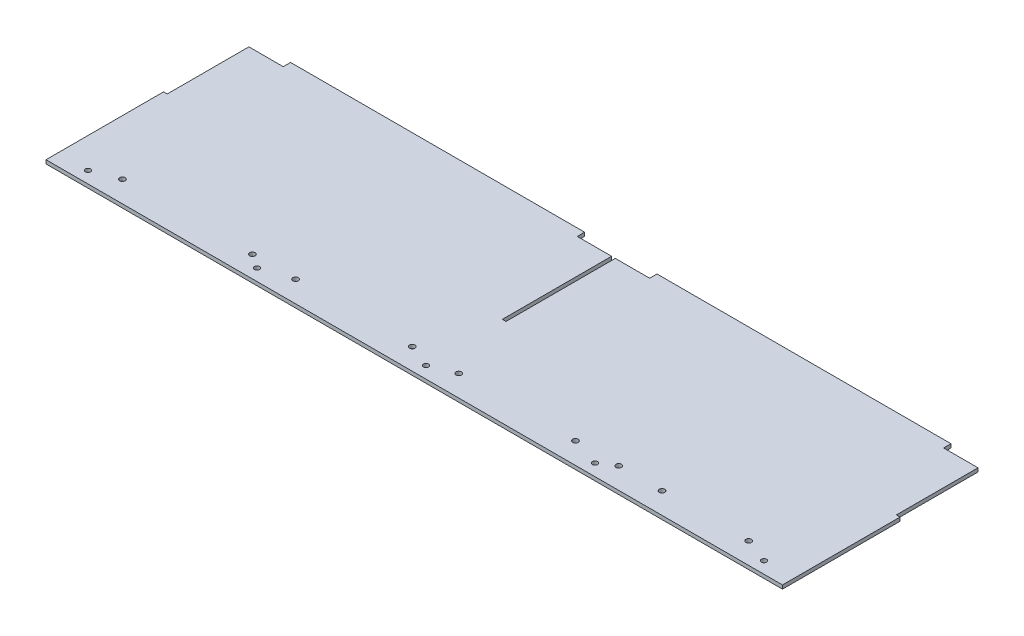
ISO-10303-21;
HEADER;
FILE_DESCRIPTION(('STEP AP214'),'2;1');
FILE_NAME('part.step','',(''),(''),'','','');
FILE_SCHEMA(('AUTOMOTIVE_DESIGN { 1 0 10303 214 1 1 1 1 }'));
ENDSEC;
DATA;
#1=APPLICATION_CONTEXT('core data for automotive mechanical design processes');
#2=APPLICATION_PROTOCOL_DEFINITION('international standard','automotive_design',2000,#1);
#3=PRODUCT_CONTEXT('',#1,'mechanical');
#4=PRODUCT('Part','Part','',(#3));
#5=PRODUCT_RELATED_PRODUCT_CATEGORY('part','',(#4));
#6=PRODUCT_DEFINITION_FORMATION('','',#4);
#7=PRODUCT_DEFINITION_CONTEXT('part definition',#1,'design');
#8=PRODUCT_DEFINITION('design','',#6,#7);
#9=PRODUCT_DEFINITION_SHAPE('','',#8);
#10=(LENGTH_UNIT() NAMED_UNIT(*) SI_UNIT(.MILLI.,.METRE.));
#11=(NAMED_UNIT(*) PLANE_ANGLE_UNIT() SI_UNIT($,.RADIAN.));
#12=(NAMED_UNIT(*) SI_UNIT($,.STERADIAN.) SOLID_ANGLE_UNIT());
#13=UNCERTAINTY_MEASURE_WITH_UNIT(LENGTH_MEASURE(1.E-05),#10,'distance_accuracy_value','');
#14=(GEOMETRIC_REPRESENTATION_CONTEXT(3) GLOBAL_UNCERTAINTY_ASSIGNED_CONTEXT((#13)) GLOBAL_UNIT_ASSIGNED_CONTEXT((#10,
#11,#12)) REPRESENTATION_CONTEXT('',''));
#15=CARTESIAN_POINT('',(0.,0.,0.));
#16=DIRECTION('',(0.,0.,1.));
#17=DIRECTION('',(1.,0.,0.));
#18=AXIS2_PLACEMENT_3D('',#15,#16,#17);
#19=CARTESIAN_POINT('',(629.90984,3.175,0.));
#20=DIRECTION('',(-1.,0.,0.));
#21=DIRECTION('',(0.,0.,-1.));
#22=AXIS2_PLACEMENT_3D('',#19,#20,#21);
#23=PLANE('',#22);
#24=DIRECTION('',(0.,0.,-1.));
#25=VECTOR('',#24,1.);
#26=CARTESIAN_POINT('',(629.90984,3.175,0.));
#27=LINE('',#26,#25);
#28=CARTESIAN_POINT('',(629.90984,3.175,-77.20584));
#29=VERTEX_POINT('',#28);
#30=CARTESIAN_POINT('',(629.90984,3.175,-147.69846));
#31=VERTEX_POINT('',#30);
#32=EDGE_CURVE('E258',#29,#31,#27,.T.);
#33=ORIENTED_EDGE('',*,*,#32,.F.);
#34=DIRECTION('',(0.,-1.,0.));
#35=VECTOR('',#34,1.);
#36=CARTESIAN_POINT('',(629.90984,3.175,-77.20584));
#37=LINE('',#36,#35);
#38=CARTESIAN_POINT('',(629.90984,0.,-77.20584));
#39=VERTEX_POINT('',#38);
#40=EDGE_CURVE('E217',#29,#39,#37,.T.);
#41=ORIENTED_EDGE('',*,*,#40,.T.);
#42=DIRECTION('',(0.,0.,-1.));
#43=VECTOR('',#42,1.);
#44=CARTESIAN_POINT('',(629.90984,0.,0.));
#45=LINE('',#44,#43);
#46=CARTESIAN_POINT('',(629.90984,0.,-147.69846));
#47=VERTEX_POINT('',#46);
#48=EDGE_CURVE('E283',#39,#47,#45,.T.);
#49=ORIENTED_EDGE('',*,*,#48,.T.);
#50=DIRECTION('',(0.,1.,0.));
#51=VECTOR('',#50,1.);
#52=CARTESIAN_POINT('',(629.90984,3.175,-147.69846));
#53=LINE('',#52,#51);
#54=EDGE_CURVE('E318',#47,#31,#53,.T.);
#55=ORIENTED_EDGE('',*,*,#54,.T.);
#56=EDGE_LOOP('',(#33,#41,#49,#55));
#57=FACE_BOUND('',#56,.T.);
#58=ADVANCED_FACE('F38',(#57),#23,.F.);
#59=CARTESIAN_POINT('',(313.36742,3.175,-53.3320399735148));
#60=DIRECTION('',(0.,0.,-1.));
#61=DIRECTION('',(1.,0.,0.));
#62=AXIS2_PLACEMENT_3D('',#59,#60,#61);
#63=PLANE('',#62);
#64=DIRECTION('',(0.,1.,0.));
#65=VECTOR('',#64,1.);
#66=CARTESIAN_POINT('',(316.54242,3.175,-53.3320399735148));
#67=LINE('',#66,#65);
#68=CARTESIAN_POINT('',(316.54242,0.,-53.3320399735148));
#69=VERTEX_POINT('',#68);
#70=CARTESIAN_POINT('',(316.54242,3.175,-53.3320399735148));
#71=VERTEX_POINT('',#70);
#72=EDGE_CURVE('E11',#69,#71,#67,.T.);
#73=ORIENTED_EDGE('',*,*,#72,.F.);
#74=DIRECTION('',(1.,0.,0.));
#75=VECTOR('',#74,1.);
#76=CARTESIAN_POINT('',(0.,0.,-53.3320399735148));
#77=LINE('',#76,#75);
#78=CARTESIAN_POINT('',(313.36742,0.,-53.3320399735148));
#79=VERTEX_POINT('',#78);
#80=EDGE_CURVE('E305',#79,#69,#77,.T.);
#81=ORIENTED_EDGE('',*,*,#80,.F.);
#82=DIRECTION('',(0.,1.,0.));
#83=VECTOR('',#82,1.);
#84=CARTESIAN_POINT('',(313.36742,3.175,-53.3320399735148));
#85=LINE('',#84,#83);
#86=CARTESIAN_POINT('',(313.36742,3.175,-53.3320399735148));
#87=VERTEX_POINT('',#86);
#88=EDGE_CURVE('E47',#79,#87,#85,.T.);
#89=ORIENTED_EDGE('',*,*,#88,.T.);
#90=DIRECTION('',(1.,0.,0.));
#91=VECTOR('',#90,1.);
#92=CARTESIAN_POINT('',(313.36742,3.175,-53.3320399735148));
#93=LINE('',#92,#91);
#94=EDGE_CURVE('E240',#87,#71,#93,.T.);
#95=ORIENTED_EDGE('',*,*,#94,.T.);
#96=EDGE_LOOP('',(#73,#81,#89,#95));
#97=FACE_BOUND('',#96,.T.);
#98=ADVANCED_FACE('F336',(#97),#63,.T.);
#99=CARTESIAN_POINT('',(313.36742,3.175,-53.3320399735148));
#100=DIRECTION('',(1.,0.,0.));
#101=DIRECTION('',(0.,0.,1.));
#102=AXIS2_PLACEMENT_3D('',#99,#100,#101);
#103=PLANE('',#102);
#104=ORIENTED_EDGE('',*,*,#88,.F.);
#105=DIRECTION('',(0.,0.,-1.));
#106=VECTOR('',#105,1.);
#107=CARTESIAN_POINT('',(313.36742,0.,0.));
#108=LINE('',#107,#106);
#109=CARTESIAN_POINT('',(313.36742,0.,-147.69846));
#110=VERTEX_POINT('',#109);
#111=EDGE_CURVE('E302',#110,#79,#108,.F.);
#112=ORIENTED_EDGE('',*,*,#111,.F.);
#113=DIRECTION('',(0.,1.,0.));
#114=VECTOR('',#113,1.);
#115=CARTESIAN_POINT('',(313.36742,3.175,-147.69846));
#116=LINE('',#115,#114);
#117=CARTESIAN_POINT('',(313.36742,3.175,-147.69846));
#118=VERTEX_POINT('',#117);
#119=EDGE_CURVE('E331',#110,#118,#116,.T.);
#120=ORIENTED_EDGE('',*,*,#119,.T.);
#121=DIRECTION('',(0.,0.,1.));
#122=VECTOR('',#121,1.);
#123=CARTESIAN_POINT('',(313.36742,3.175,-53.3320399735148));
#124=LINE('',#123,#122);
#125=EDGE_CURVE('E243',#118,#87,#124,.T.);
#126=ORIENTED_EDGE('',*,*,#125,.T.);
#127=EDGE_LOOP('',(#104,#112,#120,#126));
#128=FACE_BOUND('',#127,.T.);
#129=ADVANCED_FACE('F345',(#128),#103,.T.);
#130=CARTESIAN_POINT('',(0.,3.175,-147.69846));
#131=DIRECTION('',(0.,0.,1.));
#132=DIRECTION('',(-1.,0.,0.));
#133=AXIS2_PLACEMENT_3D('',#130,#131,#132);
#134=PLANE('',#133);
#135=ORIENTED_EDGE('',*,*,#119,.F.);
#136=DIRECTION('',(1.,0.,0.));
#137=VECTOR('',#136,1.);
#138=CARTESIAN_POINT('',(0.,0.,-147.69846));
#139=LINE('',#138,#137);
#140=CARTESIAN_POINT('',(283.68371,0.,-147.69846));
#141=VERTEX_POINT('',#140);
#142=EDGE_CURVE('E299',#110,#141,#139,.F.);
#143=ORIENTED_EDGE('',*,*,#142,.T.);
#144=DIRECTION('',(0.,1.,0.));
#145=VECTOR('',#144,1.);
#146=CARTESIAN_POINT('',(283.68371,3.175,-147.69846));
#147=LINE('',#146,#145);
#148=CARTESIAN_POINT('',(283.68371,3.175,-147.69846));
#149=VERTEX_POINT('',#148);
#150=EDGE_CURVE('E329',#141,#149,#147,.T.);
#151=ORIENTED_EDGE('',*,*,#150,.T.);
#152=DIRECTION('',(-1.,0.,0.));
#153=VECTOR('',#152,1.);
#154=CARTESIAN_POINT('',(0.,3.175,-147.69846));
#155=LINE('',#154,#153);
#156=EDGE_CURVE('E237',#118,#149,#155,.T.);
#157=ORIENTED_EDGE('',*,*,#156,.F.);
#158=EDGE_LOOP('',(#135,#143,#151,#157));
#159=FACE_BOUND('',#158,.T.);
#160=ADVANCED_FACE('F348',(#159),#134,.F.);
#161=CARTESIAN_POINT('',(283.68371,3.17499999999993,-154.04846));
#162=DIRECTION('',(1.,0.,0.));
#163=DIRECTION('',(0.,0.,1.));
#164=AXIS2_PLACEMENT_3D('',#161,#162,#163);
#165=PLANE('',#164);
#166=ORIENTED_EDGE('',*,*,#150,.F.);
#167=DIRECTION('',(0.,0.,-1.));
#168=VECTOR('',#167,1.);
#169=CARTESIAN_POINT('',(283.68371,0.,0.));
#170=LINE('',#169,#168);
#171=CARTESIAN_POINT('',(283.68371,0.,-154.04846));
#172=VERTEX_POINT('',#171);
#173=EDGE_CURVE('E296',#172,#141,#170,.F.);
#174=ORIENTED_EDGE('',*,*,#173,.F.);
#175=DIRECTION('',(0.,1.,0.));
#176=VECTOR('',#175,1.);
#177=CARTESIAN_POINT('',(283.68371,3.17499999999993,-154.04846));
#178=LINE('',#177,#176);
#179=CARTESIAN_POINT('',(283.68371,3.17499999999993,-154.04846));
#180=VERTEX_POINT('',#179);
#181=EDGE_CURVE('E327',#172,#180,#178,.T.);
#182=ORIENTED_EDGE('',*,*,#181,.T.);
#183=DIRECTION('',(0.,0.,1.));
#184=VECTOR('',#183,1.);
#185=CARTESIAN_POINT('',(283.68371,3.17499999999993,-154.04846));
#186=LINE('',#185,#184);
#187=EDGE_CURVE('E246',#180,#149,#186,.T.);
#188=ORIENTED_EDGE('',*,*,#187,.T.);
#189=EDGE_LOOP('',(#166,#174,#182,#188));
#190=FACE_BOUND('',#189,.T.);
#191=ADVANCED_FACE('F353',(#190),#165,.T.);
#192=CARTESIAN_POINT('',(283.68371,3.17499999999993,-154.04846));
#193=DIRECTION('',(0.,0.,-1.));
#194=DIRECTION('',(1.,0.,0.));
#195=AXIS2_PLACEMENT_3D('',#192,#193,#194);
#196=PLANE('',#195);
#197=ORIENTED_EDGE('',*,*,#181,.F.);
#198=DIRECTION('',(1.,0.,0.));
#199=VECTOR('',#198,1.);
#200=CARTESIAN_POINT('',(0.,0.,-154.04846));
#201=LINE('',#200,#199);
#202=CARTESIAN_POINT('',(29.6837100000001,0.,-154.04846));
#203=VERTEX_POINT('',#202);
#204=EDGE_CURVE('E293',#203,#172,#201,.T.);
#205=ORIENTED_EDGE('',*,*,#204,.F.);
#206=DIRECTION('',(0.,1.,0.));
#207=VECTOR('',#206,1.);
#208=CARTESIAN_POINT('',(29.6837100000001,3.17499999999993,-154.04846));
#209=LINE('',#208,#207);
#210=CARTESIAN_POINT('',(29.6837100000001,3.17499999999993,-154.04846));
#211=VERTEX_POINT('',#210);
#212=EDGE_CURVE('E325',#203,#211,#209,.T.);
#213=ORIENTED_EDGE('',*,*,#212,.T.);
#214=DIRECTION('',(1.,0.,0.));
#215=VECTOR('',#214,1.);
#216=CARTESIAN_POINT('',(283.68371,3.17499999999993,-154.04846));
#217=LINE('',#216,#215);
#218=EDGE_CURVE('E249',#211,#180,#217,.T.);
#219=ORIENTED_EDGE('',*,*,#218,.T.);
#220=EDGE_LOOP('',(#197,#205,#213,#219));
#221=FACE_BOUND('',#220,.T.);
#222=ADVANCED_FACE('F409',(#221),#196,.T.);
#223=CARTESIAN_POINT('',(29.6837100000001,3.17499999999993,-154.04846));
#224=DIRECTION('',(1.,0.,0.));
#225=DIRECTION('',(0.,0.,1.));
#226=AXIS2_PLACEMENT_3D('',#223,#224,#225);
#227=PLANE('',#226);
#228=ORIENTED_EDGE('',*,*,#212,.F.);
#229=DIRECTION('',(0.,0.,-1.));
#230=VECTOR('',#229,1.);
#231=CARTESIAN_POINT('',(29.6837100000001,0.,0.));
#232=LINE('',#231,#230);
#233=CARTESIAN_POINT('',(29.6837100000001,0.,-147.69846));
#234=VERTEX_POINT('',#233);
#235=EDGE_CURVE('E290',#203,#234,#232,.F.);
#236=ORIENTED_EDGE('',*,*,#235,.T.);
#237=DIRECTION('',(0.,1.,0.));
#238=VECTOR('',#237,1.);
#239=CARTESIAN_POINT('',(29.6837100000001,3.175,-147.69846));
#240=LINE('',#239,#238);
#241=CARTESIAN_POINT('',(29.6837100000001,3.175,-147.69846));
#242=VERTEX_POINT('',#241);
#243=EDGE_CURVE('E323',#234,#242,#240,.T.);
#244=ORIENTED_EDGE('',*,*,#243,.T.);
#245=DIRECTION('',(0.,0.,1.));
#246=VECTOR('',#245,1.);
#247=CARTESIAN_POINT('',(29.6837100000001,3.17499999999993,-154.04846));
#248=LINE('',#247,#246);
#249=EDGE_CURVE('E252',#211,#242,#248,.T.);
#250=ORIENTED_EDGE('',*,*,#249,.F.);
#251=EDGE_LOOP('',(#228,#236,#244,#250));
#252=FACE_BOUND('',#251,.T.);
#253=ADVANCED_FACE('F406',(#252),#227,.F.);
#254=ORIENTED_EDGE('',*,*,#243,.F.);
#255=DIRECTION('',(1.,0.,0.));
#256=VECTOR('',#255,1.);
#257=CARTESIAN_POINT('',(0.,0.,-147.69846));
#258=LINE('',#257,#256);
#259=CARTESIAN_POINT('',(0.,0.,-147.69846));
#260=VERTEX_POINT('',#259);
#261=EDGE_CURVE('E287',#234,#260,#258,.F.);
#262=ORIENTED_EDGE('',*,*,#261,.T.);
#263=DIRECTION('',(0.,1.,0.));
#264=VECTOR('',#263,1.);
#265=CARTESIAN_POINT('',(0.,3.175,-147.69846));
#266=LINE('',#265,#264);
#267=CARTESIAN_POINT('',(0.,3.175,-147.69846));
#268=VERTEX_POINT('',#267);
#269=EDGE_CURVE('E321',#260,#268,#266,.T.);
#270=ORIENTED_EDGE('',*,*,#269,.T.);
#271=EDGE_CURVE('E255',#242,#268,#155,.T.);
#272=ORIENTED_EDGE('',*,*,#271,.F.);
#273=EDGE_LOOP('',(#254,#262,#270,#272));
#274=FACE_BOUND('',#273,.T.);
#275=ADVANCED_FACE('F392',(#274),#134,.F.);
#276=CARTESIAN_POINT('',(0.,3.175,0.));
#277=DIRECTION('',(1.,0.,0.));
#278=DIRECTION('',(0.,0.,1.));
#279=AXIS2_PLACEMENT_3D('',#276,#277,#278);
#280=PLANE('',#279);
#281=DIRECTION('',(0.,-1.,0.));
#282=VECTOR('',#281,1.);
#283=CARTESIAN_POINT('',(0.,3.175,-77.20584));
#284=LINE('',#283,#282);
#285=CARTESIAN_POINT('',(0.,3.175,-77.20584));
#286=VERTEX_POINT('',#285);
#287=CARTESIAN_POINT('',(0.,0.,-77.20584));
#288=VERTEX_POINT('',#287);
#289=EDGE_CURVE('E62',#286,#288,#284,.T.);
#290=ORIENTED_EDGE('',*,*,#289,.F.);
#291=DIRECTION('',(0.,0.,1.));
#292=VECTOR('',#291,1.);
#293=CARTESIAN_POINT('',(0.,3.175,0.));
#294=LINE('',#293,#292);
#295=EDGE_CURVE('E256',#268,#286,#294,.T.);
#296=ORIENTED_EDGE('',*,*,#295,.F.);
#297=ORIENTED_EDGE('',*,*,#269,.F.);
#298=DIRECTION('',(0.,0.,-1.));
#299=VECTOR('',#298,1.);
#300=CARTESIAN_POINT('',(0.,0.,0.));
#301=LINE('',#300,#299);
#302=EDGE_CURVE('E285',#260,#288,#301,.F.);
#303=ORIENTED_EDGE('',*,*,#302,.T.);
#304=EDGE_LOOP('',(#290,#296,#297,#303));
#305=FACE_BOUND('',#304,.T.);
#306=ADVANCED_FACE('F394',(#305),#280,.F.);
#307=ORIENTED_EDGE('',*,*,#54,.F.);
#308=DIRECTION('',(1.,0.,0.));
#309=VECTOR('',#308,1.);
#310=CARTESIAN_POINT('',(0.,0.,-147.69846));
#311=LINE('',#310,#309);
#312=CARTESIAN_POINT('',(600.22613,0.,-147.69846));
#313=VERTEX_POINT('',#312);
#314=EDGE_CURVE('E280',#47,#313,#311,.F.);
#315=ORIENTED_EDGE('',*,*,#314,.T.);
#316=DIRECTION('',(0.,1.,0.));
#317=VECTOR('',#316,1.);
#318=CARTESIAN_POINT('',(600.22613,3.175,-147.69846));
#319=LINE('',#318,#317);
#320=CARTESIAN_POINT('',(600.22613,3.175,-147.69846));
#321=VERTEX_POINT('',#320);
#322=EDGE_CURVE('E316',#313,#321,#319,.T.);
#323=ORIENTED_EDGE('',*,*,#322,.T.);
#324=EDGE_CURVE('E236',#31,#321,#155,.T.);
#325=ORIENTED_EDGE('',*,*,#324,.F.);
#326=EDGE_LOOP('',(#307,#315,#323,#325));
#327=FACE_BOUND('',#326,.T.);
#328=ADVANCED_FACE('F384',(#327),#134,.F.);
#329=CARTESIAN_POINT('',(600.22613,3.17499999999993,-154.04846));
#330=DIRECTION('',(1.,0.,0.));
#331=DIRECTION('',(0.,0.,1.));
#332=AXIS2_PLACEMENT_3D('',#329,#330,#331);
#333=PLANE('',#332);
#334=ORIENTED_EDGE('',*,*,#322,.F.);
#335=DIRECTION('',(0.,0.,-1.));
#336=VECTOR('',#335,1.);
#337=CARTESIAN_POINT('',(600.22613,0.,0.));
#338=LINE('',#337,#336);
#339=CARTESIAN_POINT('',(600.22613,0.,-154.04846));
#340=VERTEX_POINT('',#339);
#341=EDGE_CURVE('E277',#340,#313,#338,.F.);
#342=ORIENTED_EDGE('',*,*,#341,.F.);
#343=DIRECTION('',(0.,1.,0.));
#344=VECTOR('',#343,1.);
#345=CARTESIAN_POINT('',(600.22613,3.17499999999993,-154.04846));
#346=LINE('',#345,#344);
#347=CARTESIAN_POINT('',(600.22613,3.17499999999993,-154.04846));
#348=VERTEX_POINT('',#347);
#349=EDGE_CURVE('E314',#340,#348,#346,.T.);
#350=ORIENTED_EDGE('',*,*,#349,.T.);
#351=DIRECTION('',(0.,0.,1.));
#352=VECTOR('',#351,1.);
#353=CARTESIAN_POINT('',(600.22613,3.17499999999993,-154.04846));
#354=LINE('',#353,#352);
#355=EDGE_CURVE('E260',#348,#321,#354,.T.);
#356=ORIENTED_EDGE('',*,*,#355,.T.);
#357=EDGE_LOOP('',(#334,#342,#350,#356));
#358=FACE_BOUND('',#357,.T.);
#359=ADVANCED_FACE('F367',(#358),#333,.T.);
#360=CARTESIAN_POINT('',(600.22613,3.17499999999993,-154.04846));
#361=DIRECTION('',(0.,0.,-1.));
#362=DIRECTION('',(1.,0.,0.));
#363=AXIS2_PLACEMENT_3D('',#360,#361,#362);
#364=PLANE('',#363);
#365=ORIENTED_EDGE('',*,*,#349,.F.);
#366=DIRECTION('',(1.,0.,0.));
#367=VECTOR('',#366,1.);
#368=CARTESIAN_POINT('',(0.,0.,-154.04846));
#369=LINE('',#368,#367);
#370=CARTESIAN_POINT('',(346.22613,0.,-154.04846));
#371=VERTEX_POINT('',#370);
#372=EDGE_CURVE('E274',#371,#340,#369,.T.);
#373=ORIENTED_EDGE('',*,*,#372,.F.);
#374=DIRECTION('',(0.,1.,0.));
#375=VECTOR('',#374,1.);
#376=CARTESIAN_POINT('',(346.22613,3.17499999999993,-154.04846));
#377=LINE('',#376,#375);
#378=CARTESIAN_POINT('',(346.22613,3.17499999999993,-154.04846));
#379=VERTEX_POINT('',#378);
#380=EDGE_CURVE('E312',#371,#379,#377,.T.);
#381=ORIENTED_EDGE('',*,*,#380,.T.);
#382=DIRECTION('',(1.,0.,0.));
#383=VECTOR('',#382,1.);
#384=CARTESIAN_POINT('',(600.22613,3.17499999999993,-154.04846));
#385=LINE('',#384,#383);
#386=EDGE_CURVE('E263',#379,#348,#385,.T.);
#387=ORIENTED_EDGE('',*,*,#386,.T.);
#388=EDGE_LOOP('',(#365,#373,#381,#387));
#389=FACE_BOUND('',#388,.T.);
#390=ADVANCED_FACE('F371',(#389),#364,.T.);
#391=CARTESIAN_POINT('',(346.22613,3.17499999999993,-154.04846));
#392=DIRECTION('',(1.,0.,0.));
#393=DIRECTION('',(0.,0.,1.));
#394=AXIS2_PLACEMENT_3D('',#391,#392,#393);
#395=PLANE('',#394);
#396=ORIENTED_EDGE('',*,*,#380,.F.);
#397=DIRECTION('',(0.,0.,-1.));
#398=VECTOR('',#397,1.);
#399=CARTESIAN_POINT('',(346.22613,0.,0.));
#400=LINE('',#399,#398);
#401=CARTESIAN_POINT('',(346.22613,0.,-147.69846));
#402=VERTEX_POINT('',#401);
#403=EDGE_CURVE('E235',#371,#402,#400,.F.);
#404=ORIENTED_EDGE('',*,*,#403,.T.);
#405=DIRECTION('',(0.,1.,0.));
#406=VECTOR('',#405,1.);
#407=CARTESIAN_POINT('',(346.22613,3.17499999999993,-147.69846));
#408=LINE('',#407,#406);
#409=CARTESIAN_POINT('',(346.22613,3.17499999999993,-147.69846));
#410=VERTEX_POINT('',#409);
#411=EDGE_CURVE('E310',#402,#410,#408,.T.);
#412=ORIENTED_EDGE('',*,*,#411,.T.);
#413=DIRECTION('',(0.,0.,1.));
#414=VECTOR('',#413,1.);
#415=CARTESIAN_POINT('',(346.22613,3.17499999999993,-154.04846));
#416=LINE('',#415,#414);
#417=EDGE_CURVE('E266',#379,#410,#416,.T.);
#418=ORIENTED_EDGE('',*,*,#417,.F.);
#419=EDGE_LOOP('',(#396,#404,#412,#418));
#420=FACE_BOUND('',#419,.T.);
#421=ADVANCED_FACE('F375',(#420),#395,.F.);
#422=ORIENTED_EDGE('',*,*,#411,.F.);
#423=DIRECTION('',(1.,0.,0.));
#424=VECTOR('',#423,1.);
#425=CARTESIAN_POINT('',(0.,0.,-147.69846));
#426=LINE('',#425,#424);
#427=CARTESIAN_POINT('',(316.54242,0.,-147.69846));
#428=VERTEX_POINT('',#427);
#429=EDGE_CURVE('E229',#402,#428,#426,.F.);
#430=ORIENTED_EDGE('',*,*,#429,.T.);
#431=DIRECTION('',(0.,1.,0.));
#432=VECTOR('',#431,1.);
#433=CARTESIAN_POINT('',(316.54242,3.175,-147.69846));
#434=LINE('',#433,#432);
#435=CARTESIAN_POINT('',(316.54242,3.175,-147.69846));
#436=VERTEX_POINT('',#435);
#437=EDGE_CURVE('E42',#428,#436,#434,.T.);
#438=ORIENTED_EDGE('',*,*,#437,.T.);
#439=EDGE_CURVE('E231',#410,#436,#155,.T.);
#440=ORIENTED_EDGE('',*,*,#439,.F.);
#441=EDGE_LOOP('',(#422,#430,#438,#440));
#442=FACE_BOUND('',#441,.T.);
#443=ADVANCED_FACE('F381',(#442),#134,.F.);
#444=CARTESIAN_POINT('',(316.54242,3.175,-53.3320399735148));
#445=DIRECTION('',(-1.,0.,0.));
#446=DIRECTION('',(0.,0.,-1.));
#447=AXIS2_PLACEMENT_3D('',#444,#445,#446);
#448=PLANE('',#447);
#449=DIRECTION('',(0.,0.,-1.));
#450=VECTOR('',#449,1.);
#451=CARTESIAN_POINT('',(316.54242,0.,0.));
#452=LINE('',#451,#450);
#453=EDGE_CURVE('E271',#69,#428,#452,.T.);
#454=ORIENTED_EDGE('',*,*,#453,.F.);
#455=ORIENTED_EDGE('',*,*,#72,.T.);
#456=DIRECTION('',(0.,0.,-1.));
#457=VECTOR('',#456,1.);
#458=CARTESIAN_POINT('',(316.54242,3.175,-53.3320399735148));
#459=LINE('',#458,#457);
#460=EDGE_CURVE('E234',#71,#436,#459,.T.);
#461=ORIENTED_EDGE('',*,*,#460,.T.);
#462=ORIENTED_EDGE('',*,*,#437,.F.);
#463=EDGE_LOOP('',(#454,#455,#461,#462));
#464=FACE_BOUND('',#463,.T.);
#465=ADVANCED_FACE('F40',(#464),#448,.T.);
#466=CARTESIAN_POINT('',(0.,3.175,0.));
#467=DIRECTION('',(0.,-1.,0.));
#468=DIRECTION('',(0.,0.,-1.));
#469=AXIS2_PLACEMENT_3D('',#466,#467,#468);
#470=PLANE('',#469);
#471=CARTESIAN_POINT('',(44.4094127433562,3.175,5.9968400509996));
#472=DIRECTION('',(0.,1.,0.));
#473=DIRECTION('',(0.,0.,1.));
#474=AXIS2_PLACEMENT_3D('',#471,#472,#473);
#475=CIRCLE('',#474,2.39999999999999);
#476=CARTESIAN_POINT('',(44.4094127433562,3.175,8.39684005099958));
#477=VERTEX_POINT('',#476);
#478=EDGE_CURVE('E831',#477,#477,#475,.T.);
#479=ORIENTED_EDGE('',*,*,#478,.F.);
#480=EDGE_LOOP('',(#479));
#481=FACE_BOUND('',#480,.T.);
#482=CARTESIAN_POINT('',(156.683710000082,3.175,5.99684005099821));
#483=DIRECTION('',(0.,1.,0.));
#484=DIRECTION('',(0.,0.,1.));
#485=AXIS2_PLACEMENT_3D('',#482,#483,#484);
#486=CIRCLE('',#485,2.39999999999999);
#487=CARTESIAN_POINT('',(156.683710000082,3.175,8.3968400509982));
#488=VERTEX_POINT('',#487);
#489=EDGE_CURVE('E835',#488,#488,#486,.T.);
#490=ORIENTED_EDGE('',*,*,#489,.F.);
#491=EDGE_LOOP('',(#490));
#492=FACE_BOUND('',#491,.T.);
#493=CARTESIAN_POINT('',(194.108475752326,3.175,5.99684005099771));
#494=DIRECTION('',(0.,1.,0.));
#495=DIRECTION('',(0.,0.,1.));
#496=AXIS2_PLACEMENT_3D('',#493,#494,#495);
#497=CIRCLE('',#496,2.39999999999999);
#498=CARTESIAN_POINT('',(194.108475752326,3.175,8.39684005099769));
#499=VERTEX_POINT('',#498);
#500=EDGE_CURVE('E839',#499,#499,#497,.T.);
#501=ORIENTED_EDGE('',*,*,#500,.F.);
#502=EDGE_LOOP('',(#501));
#503=FACE_BOUND('',#502,.T.);
#504=CARTESIAN_POINT('',(294.859886504606,3.175,5.99684005099632));
#505=DIRECTION('',(0.,1.,0.));
#506=DIRECTION('',(0.,0.,1.));
#507=AXIS2_PLACEMENT_3D('',#504,#505,#506);
#508=CIRCLE('',#507,2.40000000000001);
#509=CARTESIAN_POINT('',(294.859886504606,3.175,8.39684005099634));
#510=VERTEX_POINT('',#509);
#511=EDGE_CURVE('E843',#510,#510,#508,.T.);
#512=ORIENTED_EDGE('',*,*,#511,.F.);
#513=EDGE_LOOP('',(#512));
#514=FACE_BOUND('',#513,.T.);
#515=CARTESIAN_POINT('',(335.049953495407,3.175,5.99684005099604));
#516=DIRECTION('',(0.,1.,0.));
#517=DIRECTION('',(0.,0.,1.));
#518=AXIS2_PLACEMENT_3D('',#515,#516,#517);
#519=CIRCLE('',#518,2.40000000000001);
#520=CARTESIAN_POINT('',(335.049953495407,3.175,8.39684005099606));
#521=VERTEX_POINT('',#520);
#522=EDGE_CURVE('E847',#521,#521,#519,.T.);
#523=ORIENTED_EDGE('',*,*,#522,.F.);
#524=EDGE_LOOP('',(#523));
#525=FACE_BOUND('',#524,.T.);
#526=CARTESIAN_POINT('',(435.801364247687,3.175,5.99684005099599));
#527=DIRECTION('',(0.,1.,0.));
#528=DIRECTION('',(0.,0.,1.));
#529=AXIS2_PLACEMENT_3D('',#526,#527,#528);
#530=CIRCLE('',#529,2.40000000000001);
#531=CARTESIAN_POINT('',(435.801364247687,3.175,8.396840050996));
#532=VERTEX_POINT('',#531);
#533=EDGE_CURVE('E851',#532,#532,#530,.T.);
#534=ORIENTED_EDGE('',*,*,#533,.F.);
#535=EDGE_LOOP('',(#534));
#536=FACE_BOUND('',#535,.T.);
#537=CARTESIAN_POINT('',(473.22612999993,3.175,5.99684005099604));
#538=DIRECTION('',(0.,1.,0.));
#539=DIRECTION('',(0.,0.,1.));
#540=AXIS2_PLACEMENT_3D('',#537,#538,#539);
#541=CIRCLE('',#540,2.40000000000001);
#542=CARTESIAN_POINT('',(473.22612999993,3.175,8.39684005099606));
#543=VERTEX_POINT('',#542);
#544=EDGE_CURVE('E855',#543,#543,#541,.T.);
#545=ORIENTED_EDGE('',*,*,#544,.F.);
#546=EDGE_LOOP('',(#545));
#547=FACE_BOUND('',#546,.T.);
#548=CARTESIAN_POINT('',(510.650895752173,3.175,5.99684005099627));
#549=DIRECTION('',(0.,1.,0.));
#550=DIRECTION('',(0.,0.,1.));
#551=AXIS2_PLACEMENT_3D('',#548,#549,#550);
#552=CIRCLE('',#551,2.39999999999996);
#553=CARTESIAN_POINT('',(510.650895752173,3.175,8.39684005099622));
#554=VERTEX_POINT('',#553);
#555=EDGE_CURVE('E859',#554,#554,#552,.T.);
#556=ORIENTED_EDGE('',*,*,#555,.F.);
#557=EDGE_LOOP('',(#556));
#558=FACE_BOUND('',#557,.T.);
#559=CARTESIAN_POINT('',(585.500427256573,3.175,5.99684005099743));
#560=DIRECTION('',(0.,1.,0.));
#561=DIRECTION('',(0.,0.,1.));
#562=AXIS2_PLACEMENT_3D('',#559,#560,#561);
#563=CIRCLE('',#562,2.39999999999996);
#564=CARTESIAN_POINT('',(585.500427256573,3.175,8.39684005099739));
#565=VERTEX_POINT('',#564);
#566=EDGE_CURVE('E863',#565,#565,#563,.T.);
#567=ORIENTED_EDGE('',*,*,#566,.F.);
#568=EDGE_LOOP('',(#567));
#569=FACE_BOUND('',#568,.T.);
#570=CARTESIAN_POINT('',(606.977733218917,3.175,14.2341599999992));
#571=DIRECTION('',(0.,1.,0.));
#572=DIRECTION('',(0.,0.,1.));
#573=AXIS2_PLACEMENT_3D('',#570,#571,#572);
#574=CIRCLE('',#573,2.25000000000001);
#575=CARTESIAN_POINT('',(606.977733218917,3.175,16.4841599999992));
#576=VERTEX_POINT('',#575);
#577=EDGE_CURVE('E867',#576,#576,#574,.T.);
#578=ORIENTED_EDGE('',*,*,#577,.F.);
#579=EDGE_LOOP('',(#578));
#580=FACE_BOUND('',#579,.T.);
#581=CARTESIAN_POINT('',(460.966326609485,3.175,14.2341600000001));
#582=DIRECTION('',(0.,1.,0.));
#583=DIRECTION('',(0.,0.,1.));
#584=AXIS2_PLACEMENT_3D('',#581,#582,#583);
#585=CIRCLE('',#584,2.24999999999995);
#586=CARTESIAN_POINT('',(460.966326609485,3.175,16.48416));
#587=VERTEX_POINT('',#586);
#588=EDGE_CURVE('E871',#587,#587,#585,.T.);
#589=ORIENTED_EDGE('',*,*,#588,.F.);
#590=EDGE_LOOP('',(#589));
#591=FACE_BOUND('',#590,.T.);
#592=CARTESIAN_POINT('',(314.95492,3.175,14.2341600000001));
#593=DIRECTION('',(0.,1.,0.));
#594=DIRECTION('',(0.,0.,1.));
#595=AXIS2_PLACEMENT_3D('',#592,#593,#594);
#596=CIRCLE('',#595,2.24999999999995);
#597=CARTESIAN_POINT('',(314.95492,3.175,16.48416));
#598=VERTEX_POINT('',#597);
#599=EDGE_CURVE('E875',#598,#598,#596,.T.);
#600=ORIENTED_EDGE('',*,*,#599,.F.);
#601=EDGE_LOOP('',(#600));
#602=FACE_BOUND('',#601,.T.);
#603=CARTESIAN_POINT('',(168.943513390621,3.175,14.2341600000021));
#604=DIRECTION('',(0.,1.,0.));
#605=DIRECTION('',(0.,0.,1.));
#606=AXIS2_PLACEMENT_3D('',#603,#604,#605);
#607=CIRCLE('',#606,2.25000000000001);
#608=CARTESIAN_POINT('',(168.943513390621,3.175,16.4841600000021));
#609=VERTEX_POINT('',#608);
#610=EDGE_CURVE('E879',#609,#609,#607,.T.);
#611=ORIENTED_EDGE('',*,*,#610,.F.);
#612=EDGE_LOOP('',(#611));
#613=FACE_BOUND('',#612,.T.);
#614=CARTESIAN_POINT('',(22.9321067811893,3.175,14.2341600000031));
#615=DIRECTION('',(0.,1.,0.));
#616=DIRECTION('',(0.,0.,1.));
#617=AXIS2_PLACEMENT_3D('',#614,#615,#616);
#618=CIRCLE('',#617,2.25);
#619=CARTESIAN_POINT('',(22.9321067811893,3.175,16.4841600000031));
#620=VERTEX_POINT('',#619);
#621=EDGE_CURVE('E208',#620,#620,#618,.T.);
#622=ORIENTED_EDGE('',*,*,#621,.F.);
#623=EDGE_LOOP('',(#622));
#624=FACE_BOUND('',#623,.T.);
#625=ORIENTED_EDGE('',*,*,#439,.T.);
#626=ORIENTED_EDGE('',*,*,#460,.F.);
#627=ORIENTED_EDGE('',*,*,#94,.F.);
#628=ORIENTED_EDGE('',*,*,#125,.F.);
#629=ORIENTED_EDGE('',*,*,#156,.T.);
#630=ORIENTED_EDGE('',*,*,#187,.F.);
#631=ORIENTED_EDGE('',*,*,#218,.F.);
#632=ORIENTED_EDGE('',*,*,#249,.T.);
#633=ORIENTED_EDGE('',*,*,#271,.T.);
#634=ORIENTED_EDGE('',*,*,#295,.T.);
#635=DIRECTION('',(1.,0.,0.));
#636=VECTOR('',#635,1.);
#637=CARTESIAN_POINT('',(0.,3.175,-77.20584));
#638=LINE('',#637,#636);
#639=CARTESIAN_POINT('',(-3.175,3.175,-77.20584));
#640=VERTEX_POINT('',#639);
#641=EDGE_CURVE('E224',#640,#286,#638,.T.);
#642=ORIENTED_EDGE('',*,*,#641,.F.);
#643=DIRECTION('',(0.,0.,-1.));
#644=VECTOR('',#643,1.);
#645=CARTESIAN_POINT('',(-3.175,3.175,-77.20584));
#646=LINE('',#645,#644);
#647=CARTESIAN_POINT('',(-3.175,3.175,24.39416));
#648=VERTEX_POINT('',#647);
#649=EDGE_CURVE('E222',#648,#640,#646,.T.);
#650=ORIENTED_EDGE('',*,*,#649,.F.);
#651=DIRECTION('',(1.,0.,0.));
#652=VECTOR('',#651,1.);
#653=CARTESIAN_POINT('',(-3.175,3.175,24.39416));
#654=LINE('',#653,#652);
#655=CARTESIAN_POINT('',(633.08484,3.175,24.39416));
#656=VERTEX_POINT('',#655);
#657=EDGE_CURVE('E196',#648,#656,#654,.T.);
#658=ORIENTED_EDGE('',*,*,#657,.T.);
#659=DIRECTION('',(0.,0.,1.));
#660=VECTOR('',#659,1.);
#661=CARTESIAN_POINT('',(633.08484,3.175,0.));
#662=LINE('',#661,#660);
#663=CARTESIAN_POINT('',(633.08484,3.175,-77.20584));
#664=VERTEX_POINT('',#663);
#665=EDGE_CURVE('E215',#664,#656,#662,.T.);
#666=ORIENTED_EDGE('',*,*,#665,.F.);
#667=DIRECTION('',(1.,0.,0.));
#668=VECTOR('',#667,1.);
#669=CARTESIAN_POINT('',(629.90984,3.175,-77.20584));
#670=LINE('',#669,#668);
#671=EDGE_CURVE('E212',#29,#664,#670,.T.);
#672=ORIENTED_EDGE('',*,*,#671,.F.);
#673=ORIENTED_EDGE('',*,*,#32,.T.);
#674=ORIENTED_EDGE('',*,*,#324,.T.);
#675=ORIENTED_EDGE('',*,*,#355,.F.);
#676=ORIENTED_EDGE('',*,*,#386,.F.);
#677=ORIENTED_EDGE('',*,*,#417,.T.);
#678=EDGE_LOOP('',(#625,#626,#627,#628,#629,#630,#631,#632,#633,#634,#642,#650,#658,#666,#672,
#673,#674,#675,#676,#677));
#679=FACE_BOUND('',#678,.T.);
#680=ADVANCED_FACE('F342',(#481,#492,#503,#514,#525,#536,#547,#558,#569,#580,#591,#602,#613,
#624,#679),#470,.F.);
#681=CARTESIAN_POINT('',(0.,0.,0.));
#682=DIRECTION('',(0.,-1.,0.));
#683=DIRECTION('',(0.,0.,-1.));
#684=AXIS2_PLACEMENT_3D('',#681,#682,#683);
#685=PLANE('',#684);
#686=CARTESIAN_POINT('',(44.4094127433562,0.,5.9968400509996));
#687=DIRECTION('',(0.,1.,0.));
#688=DIRECTION('',(0.,0.,1.));
#689=AXIS2_PLACEMENT_3D('',#686,#687,#688);
#690=CIRCLE('',#689,2.4);
#691=CARTESIAN_POINT('',(44.4094127433562,0.,8.3968400509996));
#692=VERTEX_POINT('',#691);
#693=EDGE_CURVE('E949',#692,#692,#690,.T.);
#694=ORIENTED_EDGE('',*,*,#693,.T.);
#695=EDGE_LOOP('',(#694));
#696=FACE_BOUND('',#695,.T.);
#697=CARTESIAN_POINT('',(156.683710000082,0.,5.99684005099821));
#698=DIRECTION('',(0.,1.,0.));
#699=DIRECTION('',(0.,0.,1.));
#700=AXIS2_PLACEMENT_3D('',#697,#698,#699);
#701=CIRCLE('',#700,2.39999999999999);
#702=CARTESIAN_POINT('',(156.683710000082,0.,8.3968400509982));
#703=VERTEX_POINT('',#702);
#704=EDGE_CURVE('E945',#703,#703,#701,.T.);
#705=ORIENTED_EDGE('',*,*,#704,.T.);
#706=EDGE_LOOP('',(#705));
#707=FACE_BOUND('',#706,.T.);
#708=CARTESIAN_POINT('',(194.108475752326,0.,5.99684005099771));
#709=DIRECTION('',(0.,1.,0.));
#710=DIRECTION('',(0.,0.,1.));
#711=AXIS2_PLACEMENT_3D('',#708,#709,#710);
#712=CIRCLE('',#711,2.39999999999999);
#713=CARTESIAN_POINT('',(194.108475752326,0.,8.39684005099769));
#714=VERTEX_POINT('',#713);
#715=EDGE_CURVE('E941',#714,#714,#712,.T.);
#716=ORIENTED_EDGE('',*,*,#715,.T.);
#717=EDGE_LOOP('',(#716));
#718=FACE_BOUND('',#717,.T.);
#719=CARTESIAN_POINT('',(294.859886504606,0.,5.99684005099632));
#720=DIRECTION('',(0.,1.,0.));
#721=DIRECTION('',(0.,0.,1.));
#722=AXIS2_PLACEMENT_3D('',#719,#720,#721);
#723=CIRCLE('',#722,2.40000000000001);
#724=CARTESIAN_POINT('',(294.859886504606,0.,8.39684005099634));
#725=VERTEX_POINT('',#724);
#726=EDGE_CURVE('E937',#725,#725,#723,.T.);
#727=ORIENTED_EDGE('',*,*,#726,.T.);
#728=EDGE_LOOP('',(#727));
#729=FACE_BOUND('',#728,.T.);
#730=CARTESIAN_POINT('',(335.049953495407,0.,5.99684005099604));
#731=DIRECTION('',(0.,1.,0.));
#732=DIRECTION('',(0.,0.,1.));
#733=AXIS2_PLACEMENT_3D('',#730,#731,#732);
#734=CIRCLE('',#733,2.40000000000001);
#735=CARTESIAN_POINT('',(335.049953495407,0.,8.39684005099606));
#736=VERTEX_POINT('',#735);
#737=EDGE_CURVE('E933',#736,#736,#734,.T.);
#738=ORIENTED_EDGE('',*,*,#737,.T.);
#739=EDGE_LOOP('',(#738));
#740=FACE_BOUND('',#739,.T.);
#741=CARTESIAN_POINT('',(435.801364247687,0.,5.99684005099599));
#742=DIRECTION('',(0.,1.,0.));
#743=DIRECTION('',(0.,0.,1.));
#744=AXIS2_PLACEMENT_3D('',#741,#742,#743);
#745=CIRCLE('',#744,2.40000000000001);
#746=CARTESIAN_POINT('',(435.801364247687,0.,8.396840050996));
#747=VERTEX_POINT('',#746);
#748=EDGE_CURVE('E929',#747,#747,#745,.T.);
#749=ORIENTED_EDGE('',*,*,#748,.T.);
#750=EDGE_LOOP('',(#749));
#751=FACE_BOUND('',#750,.T.);
#752=CARTESIAN_POINT('',(473.22612999993,0.,5.99684005099604));
#753=DIRECTION('',(0.,1.,0.));
#754=DIRECTION('',(0.,0.,1.));
#755=AXIS2_PLACEMENT_3D('',#752,#753,#754);
#756=CIRCLE('',#755,2.40000000000001);
#757=CARTESIAN_POINT('',(473.22612999993,0.,8.39684005099606));
#758=VERTEX_POINT('',#757);
#759=EDGE_CURVE('E925',#758,#758,#756,.T.);
#760=ORIENTED_EDGE('',*,*,#759,.T.);
#761=EDGE_LOOP('',(#760));
#762=FACE_BOUND('',#761,.T.);
#763=CARTESIAN_POINT('',(510.650895752173,0.,5.99684005099627));
#764=DIRECTION('',(0.,1.,0.));
#765=DIRECTION('',(0.,0.,1.));
#766=AXIS2_PLACEMENT_3D('',#763,#764,#765);
#767=CIRCLE('',#766,2.39999999999996);
#768=CARTESIAN_POINT('',(510.650895752173,0.,8.39684005099622));
#769=VERTEX_POINT('',#768);
#770=EDGE_CURVE('E890',#769,#769,#767,.T.);
#771=ORIENTED_EDGE('',*,*,#770,.T.);
#772=EDGE_LOOP('',(#771));
#773=FACE_BOUND('',#772,.T.);
#774=CARTESIAN_POINT('',(585.500427256573,0.,5.99684005099743));
#775=DIRECTION('',(0.,1.,0.));
#776=DIRECTION('',(0.,0.,1.));
#777=AXIS2_PLACEMENT_3D('',#774,#775,#776);
#778=CIRCLE('',#777,2.39999999999996);
#779=CARTESIAN_POINT('',(585.500427256573,0.,8.39684005099739));
#780=VERTEX_POINT('',#779);
#781=EDGE_CURVE('E884',#780,#780,#778,.T.);
#782=ORIENTED_EDGE('',*,*,#781,.T.);
#783=EDGE_LOOP('',(#782));
#784=FACE_BOUND('',#783,.T.);
#785=CARTESIAN_POINT('',(606.977733218917,0.,14.2341599999992));
#786=DIRECTION('',(0.,1.,0.));
#787=DIRECTION('',(0.,0.,1.));
#788=AXIS2_PLACEMENT_3D('',#785,#786,#787);
#789=CIRCLE('',#788,2.25000000000001);
#790=CARTESIAN_POINT('',(606.977733218917,0.,16.4841599999992));
#791=VERTEX_POINT('',#790);
#792=EDGE_CURVE('E205',#791,#791,#789,.T.);
#793=ORIENTED_EDGE('',*,*,#792,.T.);
#794=EDGE_LOOP('',(#793));
#795=FACE_BOUND('',#794,.T.);
#796=CARTESIAN_POINT('',(460.966326609485,0.,14.2341600000001));
#797=DIRECTION('',(0.,1.,0.));
#798=DIRECTION('',(0.,0.,1.));
#799=AXIS2_PLACEMENT_3D('',#796,#797,#798);
#800=CIRCLE('',#799,2.24999999999995);
#801=CARTESIAN_POINT('',(460.966326609485,0.,16.48416));
#802=VERTEX_POINT('',#801);
#803=EDGE_CURVE('E897',#802,#802,#800,.T.);
#804=ORIENTED_EDGE('',*,*,#803,.T.);
#805=EDGE_LOOP('',(#804));
#806=FACE_BOUND('',#805,.T.);
#807=CARTESIAN_POINT('',(314.95492,0.,14.2341600000001));
#808=DIRECTION('',(0.,1.,0.));
#809=DIRECTION('',(0.,0.,1.));
#810=AXIS2_PLACEMENT_3D('',#807,#808,#809);
#811=CIRCLE('',#810,2.24999999999995);
#812=CARTESIAN_POINT('',(314.95492,0.,16.48416));
#813=VERTEX_POINT('',#812);
#814=EDGE_CURVE('E901',#813,#813,#811,.T.);
#815=ORIENTED_EDGE('',*,*,#814,.T.);
#816=EDGE_LOOP('',(#815));
#817=FACE_BOUND('',#816,.T.);
#818=CARTESIAN_POINT('',(168.943513390621,0.,14.2341600000021));
#819=DIRECTION('',(0.,1.,0.));
#820=DIRECTION('',(0.,0.,1.));
#821=AXIS2_PLACEMENT_3D('',#818,#819,#820);
#822=CIRCLE('',#821,2.25000000000001);
#823=CARTESIAN_POINT('',(168.943513390621,0.,16.4841600000021));
#824=VERTEX_POINT('',#823);
#825=EDGE_CURVE('E905',#824,#824,#822,.T.);
#826=ORIENTED_EDGE('',*,*,#825,.T.);
#827=EDGE_LOOP('',(#826));
#828=FACE_BOUND('',#827,.T.);
#829=CARTESIAN_POINT('',(22.9321067811893,0.,14.2341600000031));
#830=DIRECTION('',(0.,1.,0.));
#831=DIRECTION('',(0.,0.,1.));
#832=AXIS2_PLACEMENT_3D('',#829,#830,#831);
#833=CIRCLE('',#832,2.25);
#834=CARTESIAN_POINT('',(22.9321067811893,0.,16.4841600000031));
#835=VERTEX_POINT('',#834);
#836=EDGE_CURVE('E883',#835,#835,#833,.T.);
#837=ORIENTED_EDGE('',*,*,#836,.T.);
#838=EDGE_LOOP('',(#837));
#839=FACE_BOUND('',#838,.T.);
#840=ORIENTED_EDGE('',*,*,#429,.F.);
#841=ORIENTED_EDGE('',*,*,#403,.F.);
#842=ORIENTED_EDGE('',*,*,#372,.T.);
#843=ORIENTED_EDGE('',*,*,#341,.T.);
#844=ORIENTED_EDGE('',*,*,#314,.F.);
#845=ORIENTED_EDGE('',*,*,#48,.F.);
#846=DIRECTION('',(1.,0.,0.));
#847=VECTOR('',#846,1.);
#848=CARTESIAN_POINT('',(629.90984,0.,-77.20584));
#849=LINE('',#848,#847);
#850=CARTESIAN_POINT('',(633.08484,0.,-77.20584));
#851=VERTEX_POINT('',#850);
#852=EDGE_CURVE('E54',#39,#851,#849,.T.);
#853=ORIENTED_EDGE('',*,*,#852,.T.);
#854=DIRECTION('',(0.,0.,1.));
#855=VECTOR('',#854,1.);
#856=CARTESIAN_POINT('',(633.08484,0.,0.));
#857=LINE('',#856,#855);
#858=CARTESIAN_POINT('',(633.08484,0.,24.39416));
#859=VERTEX_POINT('',#858);
#860=EDGE_CURVE('E202',#851,#859,#857,.T.);
#861=ORIENTED_EDGE('',*,*,#860,.T.);
#862=DIRECTION('',(1.,0.,0.));
#863=VECTOR('',#862,1.);
#864=CARTESIAN_POINT('',(-3.175,0.,24.39416));
#865=LINE('',#864,#863);
#866=CARTESIAN_POINT('',(-3.175,0.,24.39416));
#867=VERTEX_POINT('',#866);
#868=EDGE_CURVE('E194',#867,#859,#865,.T.);
#869=ORIENTED_EDGE('',*,*,#868,.F.);
#870=DIRECTION('',(0.,0.,-1.));
#871=VECTOR('',#870,1.);
#872=CARTESIAN_POINT('',(-3.175,0.,-77.20584));
#873=LINE('',#872,#871);
#874=CARTESIAN_POINT('',(-3.175,0.,-77.20584));
#875=VERTEX_POINT('',#874);
#876=EDGE_CURVE('E176',#867,#875,#873,.T.);
#877=ORIENTED_EDGE('',*,*,#876,.T.);
#878=DIRECTION('',(1.,0.,0.));
#879=VECTOR('',#878,1.);
#880=CARTESIAN_POINT('',(0.,0.,-77.20584));
#881=LINE('',#880,#879);
#882=EDGE_CURVE('E187',#875,#288,#881,.T.);
#883=ORIENTED_EDGE('',*,*,#882,.T.);
#884=ORIENTED_EDGE('',*,*,#302,.F.);
#885=ORIENTED_EDGE('',*,*,#261,.F.);
#886=ORIENTED_EDGE('',*,*,#235,.F.);
#887=ORIENTED_EDGE('',*,*,#204,.T.);
#888=ORIENTED_EDGE('',*,*,#173,.T.);
#889=ORIENTED_EDGE('',*,*,#142,.F.);
#890=ORIENTED_EDGE('',*,*,#111,.T.);
#891=ORIENTED_EDGE('',*,*,#80,.T.);
#892=ORIENTED_EDGE('',*,*,#453,.T.);
#893=EDGE_LOOP('',(#840,#841,#842,#843,#844,#845,#853,#861,#869,#877,#883,#884,#885,#886,#887,
#888,#889,#890,#891,#892));
#894=FACE_BOUND('',#893,.T.);
#895=ADVANCED_FACE('F200',(#696,#707,#718,#729,#740,#751,#762,#773,#784,#795,#806,#817,#828,
#839,#894),#685,.T.);
#896=CARTESIAN_POINT('',(0.,3.175,-77.20584));
#897=DIRECTION('',(0.,0.,-1.));
#898=DIRECTION('',(-1.,0.,0.));
#899=AXIS2_PLACEMENT_3D('',#896,#897,#898);
#900=PLANE('',#899);
#901=ORIENTED_EDGE('',*,*,#882,.F.);
#902=DIRECTION('',(0.,-1.,0.));
#903=VECTOR('',#902,1.);
#904=CARTESIAN_POINT('',(-3.175,3.175,-77.20584));
#905=LINE('',#904,#903);
#906=EDGE_CURVE('E182',#640,#875,#905,.T.);
#907=ORIENTED_EDGE('',*,*,#906,.F.);
#908=ORIENTED_EDGE('',*,*,#641,.T.);
#909=ORIENTED_EDGE('',*,*,#289,.T.);
#910=EDGE_LOOP('',(#901,#907,#908,#909));
#911=FACE_BOUND('',#910,.T.);
#912=ADVANCED_FACE('F667',(#911),#900,.T.);
#913=CARTESIAN_POINT('',(-3.175,3.175,-77.20584));
#914=DIRECTION('',(-1.,0.,0.));
#915=DIRECTION('',(0.,0.,1.));
#916=AXIS2_PLACEMENT_3D('',#913,#914,#915);
#917=PLANE('',#916);
#918=ORIENTED_EDGE('',*,*,#876,.F.);
#919=DIRECTION('',(0.,1.,0.));
#920=VECTOR('',#919,1.);
#921=CARTESIAN_POINT('',(-3.175,0.,24.39416));
#922=LINE('',#921,#920);
#923=EDGE_CURVE('E180',#867,#648,#922,.T.);
#924=ORIENTED_EDGE('',*,*,#923,.T.);
#925=ORIENTED_EDGE('',*,*,#649,.T.);
#926=ORIENTED_EDGE('',*,*,#906,.T.);
#927=EDGE_LOOP('',(#918,#924,#925,#926));
#928=FACE_BOUND('',#927,.T.);
#929=ADVANCED_FACE('F178',(#928),#917,.T.);
#930=CARTESIAN_POINT('',(633.08484,3.175,0.));
#931=DIRECTION('',(1.,0.,0.));
#932=DIRECTION('',(0.,0.,-1.));
#933=AXIS2_PLACEMENT_3D('',#930,#931,#932);
#934=PLANE('',#933);
#935=ORIENTED_EDGE('',*,*,#860,.F.);
#936=DIRECTION('',(0.,-1.,0.));
#937=VECTOR('',#936,1.);
#938=CARTESIAN_POINT('',(633.08484,3.175,-77.20584));
#939=LINE('',#938,#937);
#940=EDGE_CURVE('E188',#664,#851,#939,.T.);
#941=ORIENTED_EDGE('',*,*,#940,.F.);
#942=ORIENTED_EDGE('',*,*,#665,.T.);
#943=DIRECTION('',(0.,1.,0.));
#944=VECTOR('',#943,1.);
#945=CARTESIAN_POINT('',(633.08484,0.,24.39416));
#946=LINE('',#945,#944);
#947=EDGE_CURVE('E197',#859,#656,#946,.T.);
#948=ORIENTED_EDGE('',*,*,#947,.F.);
#949=EDGE_LOOP('',(#935,#941,#942,#948));
#950=FACE_BOUND('',#949,.T.);
#951=ADVANCED_FACE('F657',(#950),#934,.T.);
#952=CARTESIAN_POINT('',(629.90984,3.175,-77.20584));
#953=DIRECTION('',(0.,0.,-1.));
#954=DIRECTION('',(-1.,0.,0.));
#955=AXIS2_PLACEMENT_3D('',#952,#953,#954);
#956=PLANE('',#955);
#957=ORIENTED_EDGE('',*,*,#852,.F.);
#958=ORIENTED_EDGE('',*,*,#40,.F.);
#959=ORIENTED_EDGE('',*,*,#671,.T.);
#960=ORIENTED_EDGE('',*,*,#940,.T.);
#961=EDGE_LOOP('',(#957,#958,#959,#960));
#962=FACE_BOUND('',#961,.T.);
#963=ADVANCED_FACE('F653',(#962),#956,.T.);
#964=CARTESIAN_POINT('',(-3.175,0.,24.39416));
#965=DIRECTION('',(0.,0.,1.));
#966=DIRECTION('',(1.,0.,0.));
#967=AXIS2_PLACEMENT_3D('',#964,#965,#966);
#968=PLANE('',#967);
#969=ORIENTED_EDGE('',*,*,#657,.F.);
#970=ORIENTED_EDGE('',*,*,#923,.F.);
#971=ORIENTED_EDGE('',*,*,#868,.T.);
#972=ORIENTED_EDGE('',*,*,#947,.T.);
#973=EDGE_LOOP('',(#969,#970,#971,#972));
#974=FACE_BOUND('',#973,.T.);
#975=ADVANCED_FACE('F192',(#974),#968,.T.);
#976=CARTESIAN_POINT('',(22.9321067811893,0.,14.2341600000031));
#977=DIRECTION('',(0.,1.,0.));
#978=DIRECTION('',(0.,0.,1.));
#979=AXIS2_PLACEMENT_3D('',#976,#977,#978);
#980=CYLINDRICAL_SURFACE('',#979,2.25);
#981=ORIENTED_EDGE('',*,*,#836,.F.);
#982=EDGE_LOOP('',(#981));
#983=FACE_BOUND('',#982,.T.);
#984=ORIENTED_EDGE('',*,*,#621,.T.);
#985=EDGE_LOOP('',(#984));
#986=FACE_BOUND('',#985,.T.);
#987=ADVANCED_FACE('F497',(#983,#986),#980,.F.);
#988=CARTESIAN_POINT('',(168.943513390621,0.,14.2341600000021));
#989=DIRECTION('',(0.,1.,0.));
#990=DIRECTION('',(0.,0.,1.));
#991=AXIS2_PLACEMENT_3D('',#988,#989,#990);
#992=CYLINDRICAL_SURFACE('',#991,2.25000000000001);
#993=ORIENTED_EDGE('',*,*,#825,.F.);
#994=EDGE_LOOP('',(#993));
#995=FACE_BOUND('',#994,.T.);
#996=ORIENTED_EDGE('',*,*,#610,.T.);
#997=EDGE_LOOP('',(#996));
#998=FACE_BOUND('',#997,.T.);
#999=ADVANCED_FACE('F502',(#995,#998),#992,.F.);
#1000=CARTESIAN_POINT('',(314.95492,0.,14.2341600000001));
#1001=DIRECTION('',(0.,1.,0.));
#1002=DIRECTION('',(0.,0.,1.));
#1003=AXIS2_PLACEMENT_3D('',#1000,#1001,#1002);
#1004=CYLINDRICAL_SURFACE('',#1003,2.24999999999995);
#1005=ORIENTED_EDGE('',*,*,#814,.F.);
#1006=EDGE_LOOP('',(#1005));
#1007=FACE_BOUND('',#1006,.T.);
#1008=ORIENTED_EDGE('',*,*,#599,.T.);
#1009=EDGE_LOOP('',(#1008));
#1010=FACE_BOUND('',#1009,.T.);
#1011=ADVANCED_FACE('F513',(#1007,#1010),#1004,.F.);
#1012=CARTESIAN_POINT('',(460.966326609485,0.,14.2341600000001));
#1013=DIRECTION('',(0.,1.,0.));
#1014=DIRECTION('',(0.,0.,1.));
#1015=AXIS2_PLACEMENT_3D('',#1012,#1013,#1014);
#1016=CYLINDRICAL_SURFACE('',#1015,2.24999999999995);
#1017=ORIENTED_EDGE('',*,*,#803,.F.);
#1018=EDGE_LOOP('',(#1017));
#1019=FACE_BOUND('',#1018,.T.);
#1020=ORIENTED_EDGE('',*,*,#588,.T.);
#1021=EDGE_LOOP('',(#1020));
#1022=FACE_BOUND('',#1021,.T.);
#1023=ADVANCED_FACE('F523',(#1019,#1022),#1016,.F.);
#1024=CARTESIAN_POINT('',(606.977733218917,0.,14.2341599999992));
#1025=DIRECTION('',(0.,1.,0.));
#1026=DIRECTION('',(0.,0.,1.));
#1027=AXIS2_PLACEMENT_3D('',#1024,#1025,#1026);
#1028=CYLINDRICAL_SURFACE('',#1027,2.25000000000001);
#1029=ORIENTED_EDGE('',*,*,#792,.F.);
#1030=EDGE_LOOP('',(#1029));
#1031=FACE_BOUND('',#1030,.T.);
#1032=ORIENTED_EDGE('',*,*,#577,.T.);
#1033=EDGE_LOOP('',(#1032));
#1034=FACE_BOUND('',#1033,.T.);
#1035=ADVANCED_FACE('F533',(#1031,#1034),#1028,.F.);
#1036=CARTESIAN_POINT('',(585.500427256573,3.175,5.99684005099743));
#1037=DIRECTION('',(0.,1.,0.));
#1038=DIRECTION('',(0.,0.,1.));
#1039=AXIS2_PLACEMENT_3D('',#1036,#1037,#1038);
#1040=CYLINDRICAL_SURFACE('',#1039,2.39999999999996);
#1041=ORIENTED_EDGE('',*,*,#781,.F.);
#1042=EDGE_LOOP('',(#1041));
#1043=FACE_BOUND('',#1042,.T.);
#1044=ORIENTED_EDGE('',*,*,#566,.T.);
#1045=EDGE_LOOP('',(#1044));
#1046=FACE_BOUND('',#1045,.T.);
#1047=ADVANCED_FACE('F542',(#1043,#1046),#1040,.F.);
#1048=CARTESIAN_POINT('',(510.650895752173,3.175,5.99684005099627));
#1049=DIRECTION('',(0.,1.,0.));
#1050=DIRECTION('',(0.,0.,1.));
#1051=AXIS2_PLACEMENT_3D('',#1048,#1049,#1050);
#1052=CYLINDRICAL_SURFACE('',#1051,2.39999999999996);
#1053=ORIENTED_EDGE('',*,*,#770,.F.);
#1054=EDGE_LOOP('',(#1053));
#1055=FACE_BOUND('',#1054,.T.);
#1056=ORIENTED_EDGE('',*,*,#555,.T.);
#1057=EDGE_LOOP('',(#1056));
#1058=FACE_BOUND('',#1057,.T.);
#1059=ADVANCED_FACE('F556',(#1055,#1058),#1052,.F.);
#1060=CARTESIAN_POINT('',(473.22612999993,3.175,5.99684005099604));
#1061=DIRECTION('',(0.,1.,0.));
#1062=DIRECTION('',(0.,0.,1.));
#1063=AXIS2_PLACEMENT_3D('',#1060,#1061,#1062);
#1064=CYLINDRICAL_SURFACE('',#1063,2.40000000000001);
#1065=ORIENTED_EDGE('',*,*,#759,.F.);
#1066=EDGE_LOOP('',(#1065));
#1067=FACE_BOUND('',#1066,.T.);
#1068=ORIENTED_EDGE('',*,*,#544,.T.);
#1069=EDGE_LOOP('',(#1068));
#1070=FACE_BOUND('',#1069,.T.);
#1071=ADVANCED_FACE('F566',(#1067,#1070),#1064,.F.);
#1072=CARTESIAN_POINT('',(435.801364247687,3.175,5.99684005099599));
#1073=DIRECTION('',(0.,1.,0.));
#1074=DIRECTION('',(0.,0.,1.));
#1075=AXIS2_PLACEMENT_3D('',#1072,#1073,#1074);
#1076=CYLINDRICAL_SURFACE('',#1075,2.40000000000001);
#1077=ORIENTED_EDGE('',*,*,#748,.F.);
#1078=EDGE_LOOP('',(#1077));
#1079=FACE_BOUND('',#1078,.T.);
#1080=ORIENTED_EDGE('',*,*,#533,.T.);
#1081=EDGE_LOOP('',(#1080));
#1082=FACE_BOUND('',#1081,.T.);
#1083=ADVANCED_FACE('F575',(#1079,#1082),#1076,.F.);
#1084=CARTESIAN_POINT('',(335.049953495407,3.175,5.99684005099604));
#1085=DIRECTION('',(0.,1.,0.));
#1086=DIRECTION('',(0.,0.,1.));
#1087=AXIS2_PLACEMENT_3D('',#1084,#1085,#1086);
#1088=CYLINDRICAL_SURFACE('',#1087,2.40000000000001);
#1089=ORIENTED_EDGE('',*,*,#737,.F.);
#1090=EDGE_LOOP('',(#1089));
#1091=FACE_BOUND('',#1090,.T.);
#1092=ORIENTED_EDGE('',*,*,#522,.T.);
#1093=EDGE_LOOP('',(#1092));
#1094=FACE_BOUND('',#1093,.T.);
#1095=ADVANCED_FACE('F584',(#1091,#1094),#1088,.F.);
#1096=CARTESIAN_POINT('',(294.859886504606,3.175,5.99684005099632));
#1097=DIRECTION('',(0.,1.,0.));
#1098=DIRECTION('',(0.,0.,1.));
#1099=AXIS2_PLACEMENT_3D('',#1096,#1097,#1098);
#1100=CYLINDRICAL_SURFACE('',#1099,2.40000000000001);
#1101=ORIENTED_EDGE('',*,*,#726,.F.);
#1102=EDGE_LOOP('',(#1101));
#1103=FACE_BOUND('',#1102,.T.);
#1104=ORIENTED_EDGE('',*,*,#511,.T.);
#1105=EDGE_LOOP('',(#1104));
#1106=FACE_BOUND('',#1105,.T.);
#1107=ADVANCED_FACE('F593',(#1103,#1106),#1100,.F.);
#1108=CARTESIAN_POINT('',(194.108475752326,3.175,5.99684005099771));
#1109=DIRECTION('',(0.,1.,0.));
#1110=DIRECTION('',(0.,0.,1.));
#1111=AXIS2_PLACEMENT_3D('',#1108,#1109,#1110);
#1112=CYLINDRICAL_SURFACE('',#1111,2.39999999999999);
#1113=ORIENTED_EDGE('',*,*,#715,.F.);
#1114=EDGE_LOOP('',(#1113));
#1115=FACE_BOUND('',#1114,.T.);
#1116=ORIENTED_EDGE('',*,*,#500,.T.);
#1117=EDGE_LOOP('',(#1116));
#1118=FACE_BOUND('',#1117,.T.);
#1119=ADVANCED_FACE('F602',(#1115,#1118),#1112,.F.);
#1120=CARTESIAN_POINT('',(156.683710000082,3.175,5.99684005099821));
#1121=DIRECTION('',(0.,1.,0.));
#1122=DIRECTION('',(0.,0.,1.));
#1123=AXIS2_PLACEMENT_3D('',#1120,#1121,#1122);
#1124=CYLINDRICAL_SURFACE('',#1123,2.39999999999999);
#1125=ORIENTED_EDGE('',*,*,#704,.F.);
#1126=EDGE_LOOP('',(#1125));
#1127=FACE_BOUND('',#1126,.T.);
#1128=ORIENTED_EDGE('',*,*,#489,.T.);
#1129=EDGE_LOOP('',(#1128));
#1130=FACE_BOUND('',#1129,.T.);
#1131=ADVANCED_FACE('F611',(#1127,#1130),#1124,.F.);
#1132=CARTESIAN_POINT('',(44.4094127433562,3.175,5.9968400509996));
#1133=DIRECTION('',(0.,1.,0.));
#1134=DIRECTION('',(0.,0.,1.));
#1135=AXIS2_PLACEMENT_3D('',#1132,#1133,#1134);
#1136=CYLINDRICAL_SURFACE('',#1135,2.39999999999999);
#1137=ORIENTED_EDGE('',*,*,#693,.F.);
#1138=EDGE_LOOP('',(#1137));
#1139=FACE_BOUND('',#1138,.T.);
#1140=ORIENTED_EDGE('',*,*,#478,.T.);
#1141=EDGE_LOOP('',(#1140));
#1142=FACE_BOUND('',#1141,.T.);
#1143=ADVANCED_FACE('F620',(#1139,#1142),#1136,.F.);
#1144=CLOSED_SHELL('',(#58,#98,#129,#160,#191,#222,#253,#275,#306,#328,#359,#390,#421,#443,#465,
#680,#895,#912,#929,#951,#963,#975,#987,#999,#1011,#1023,#1035,#1047,#1059,#1071,#1083,#1095,
#1107,#1119,#1131,#1143));
#1145=MANIFOLD_SOLID_BREP('B2',#1144);
#1146=ADVANCED_BREP_SHAPE_REPRESENTATION('',(#18,#1145),#14);
#1147=SHAPE_DEFINITION_REPRESENTATION(#9,#1146);
ENDSEC;
END-ISO-10303-21;
